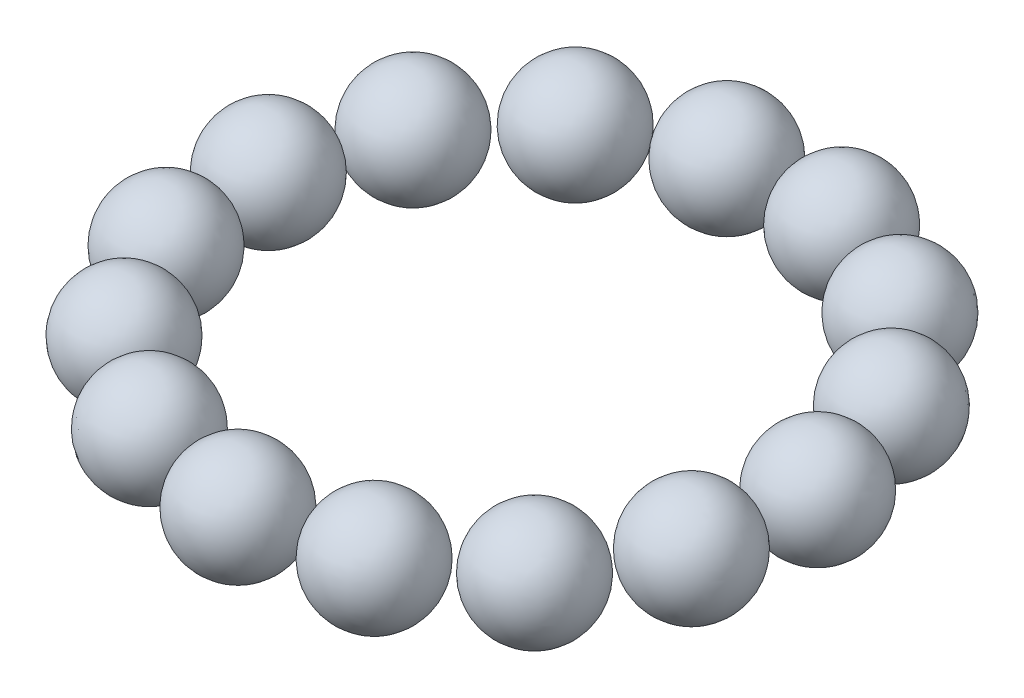
ISO-10303-21;
HEADER;
FILE_DESCRIPTION(('STEP AP214'),'2;1');
FILE_NAME('part.step','',(''),(''),'','','');
FILE_SCHEMA(('AUTOMOTIVE_DESIGN { 1 0 10303 214 1 1 1 1 }'));
ENDSEC;
DATA;
#1=APPLICATION_CONTEXT('core data for automotive mechanical design processes');
#2=APPLICATION_PROTOCOL_DEFINITION('international standard','automotive_design',2000,#1);
#3=PRODUCT_CONTEXT('',#1,'mechanical');
#4=PRODUCT('Part','Part','',(#3));
#5=PRODUCT_RELATED_PRODUCT_CATEGORY('part','',(#4));
#6=PRODUCT_DEFINITION_FORMATION('','',#4);
#7=PRODUCT_DEFINITION_CONTEXT('part definition',#1,'design');
#8=PRODUCT_DEFINITION('design','',#6,#7);
#9=PRODUCT_DEFINITION_SHAPE('','',#8);
#10=(LENGTH_UNIT() NAMED_UNIT(*) SI_UNIT(.MILLI.,.METRE.));
#11=(NAMED_UNIT(*) PLANE_ANGLE_UNIT() SI_UNIT($,.RADIAN.));
#12=(NAMED_UNIT(*) SI_UNIT($,.STERADIAN.) SOLID_ANGLE_UNIT());
#13=UNCERTAINTY_MEASURE_WITH_UNIT(LENGTH_MEASURE(1.E-05),#10,'distance_accuracy_value','');
#14=(GEOMETRIC_REPRESENTATION_CONTEXT(3) GLOBAL_UNCERTAINTY_ASSIGNED_CONTEXT((#13)) GLOBAL_UNIT_ASSIGNED_CONTEXT((#10,
#11,#12)) REPRESENTATION_CONTEXT('',''));
#15=CARTESIAN_POINT('',(0.,0.,0.));
#16=DIRECTION('',(0.,0.,1.));
#17=DIRECTION('',(1.,0.,0.));
#18=AXIS2_PLACEMENT_3D('',#15,#16,#17);
#19=CARTESIAN_POINT('',(-8.13473286151578,0.,18.2709091528521));
#20=DIRECTION('',(0.,-1.,0.));
#21=DIRECTION('',(-0.406736643075789,0.,0.913545457642606));
#22=AXIS2_PLACEMENT_3D('',#19,#20,#21);
#23=SPHERICAL_SURFACE('',#22,4.);
#24=CARTESIAN_POINT('',(-8.13473286151578,-4.,18.2709091528521));
#25=VERTEX_POINT('',#24);
#26=VERTEX_LOOP('',#25);
#27=FACE_BOUND('',#26,.T.);
#28=ADVANCED_FACE('F46',(#27),#23,.T.);
#29=CLOSED_SHELL('',(#28));
#30=MANIFOLD_SOLID_BREP('B2',#29);
#31=CARTESIAN_POINT('',(-14.8628965095477,0.,13.3826121271773));
#32=DIRECTION('',(0.,-1.,0.));
#33=DIRECTION('',(-0.743144825477386,0.,0.669130606358867));
#34=AXIS2_PLACEMENT_3D('',#31,#32,#33);
#35=SPHERICAL_SURFACE('',#34,4.);
#36=CARTESIAN_POINT('',(-14.8628965095477,-4.,13.3826121271773));
#37=VERTEX_POINT('',#36);
#38=VERTEX_LOOP('',#37);
#39=FACE_BOUND('',#38,.T.);
#40=ADVANCED_FACE('F61',(#39),#35,.T.);
#41=CLOSED_SHELL('',(#40));
#42=MANIFOLD_SOLID_BREP('B6',#41);
#43=CARTESIAN_POINT('',(-19.021130325903,0.,6.18033988749915));
#44=DIRECTION('',(0.,-1.,0.));
#45=DIRECTION('',(-0.95105651629515,0.,0.309016994374957));
#46=AXIS2_PLACEMENT_3D('',#43,#44,#45);
#47=SPHERICAL_SURFACE('',#46,4.);
#48=CARTESIAN_POINT('',(-19.021130325903,-4.,6.18033988749915));
#49=VERTEX_POINT('',#48);
#50=VERTEX_LOOP('',#49);
#51=FACE_BOUND('',#50,.T.);
#52=ADVANCED_FACE('F81',(#51),#47,.T.);
#53=CLOSED_SHELL('',(#52));
#54=MANIFOLD_SOLID_BREP('B45',#53);
#55=CARTESIAN_POINT('',(-19.8904379073655,0.,-2.09056926535287));
#56=DIRECTION('',(0.,-1.,0.));
#57=DIRECTION('',(-0.994521895368274,0.,-0.104528463267644));
#58=AXIS2_PLACEMENT_3D('',#55,#56,#57);
#59=SPHERICAL_SURFACE('',#58,4.);
#60=CARTESIAN_POINT('',(-19.8904379073655,-4.,-2.09056926535287));
#61=VERTEX_POINT('',#60);
#62=VERTEX_LOOP('',#61);
#63=FACE_BOUND('',#62,.T.);
#64=ADVANCED_FACE('F103',(#63),#59,.T.);
#65=CLOSED_SHELL('',(#64));
#66=MANIFOLD_SOLID_BREP('B63',#65);
#67=CARTESIAN_POINT('',(-17.3205080756889,0.,-9.99999999999984));
#68=DIRECTION('',(0.,-1.,0.));
#69=DIRECTION('',(-0.866025403784443,0.,-0.499999999999992));
#70=AXIS2_PLACEMENT_3D('',#67,#68,#69);
#71=SPHERICAL_SURFACE('',#70,4.);
#72=CARTESIAN_POINT('',(-17.3205080756889,-4.,-9.99999999999984));
#73=VERTEX_POINT('',#72);
#74=VERTEX_LOOP('',#73);
#75=FACE_BOUND('',#74,.T.);
#76=ADVANCED_FACE('F124',(#75),#71,.T.);
#77=CLOSED_SHELL('',(#76));
#78=MANIFOLD_SOLID_BREP('B76',#77);
#79=CARTESIAN_POINT('',(-11.7557050458496,0.,-16.1803398874988));
#80=DIRECTION('',(0.,-1.,0.));
#81=DIRECTION('',(-0.58778525229248,0.,-0.809016994374943));
#82=AXIS2_PLACEMENT_3D('',#79,#80,#81);
#83=SPHERICAL_SURFACE('',#82,4.);
#84=CARTESIAN_POINT('',(-11.7557050458496,-4.,-16.1803398874988));
#85=VERTEX_POINT('',#84);
#86=VERTEX_LOOP('',#85);
#87=FACE_BOUND('',#86,.T.);
#88=ADVANCED_FACE('F143',(#87),#83,.T.);
#89=CLOSED_SHELL('',(#88));
#90=MANIFOLD_SOLID_BREP('B97',#89);
#91=CARTESIAN_POINT('',(-4.15823381635533,0.,-19.5629520146761));
#92=DIRECTION('',(0.,-1.,0.));
#93=DIRECTION('',(-0.207911690817766,0.,-0.978147600733804));
#94=AXIS2_PLACEMENT_3D('',#91,#92,#93);
#95=SPHERICAL_SURFACE('',#94,4.);
#96=CARTESIAN_POINT('',(-4.15823381635533,-4.,-19.5629520146761));
#97=VERTEX_POINT('',#96);
#98=VERTEX_LOOP('',#97);
#99=FACE_BOUND('',#98,.T.);
#100=ADVANCED_FACE('F159',(#99),#95,.T.);
#101=CLOSED_SHELL('',(#100));
#102=MANIFOLD_SOLID_BREP('B117',#101);
#103=CARTESIAN_POINT('',(4.15823381635507,0.,-19.5629520146761));
#104=DIRECTION('',(0.,-1.,0.));
#105=DIRECTION('',(0.207911690817753,0.,-0.978147600733807));
#106=AXIS2_PLACEMENT_3D('',#103,#104,#105);
#107=SPHERICAL_SURFACE('',#106,4.);
#108=CARTESIAN_POINT('',(4.15823381635507,-4.,-19.5629520146761));
#109=VERTEX_POINT('',#108);
#110=VERTEX_LOOP('',#109);
#111=FACE_BOUND('',#110,.T.);
#112=ADVANCED_FACE('F176',(#111),#107,.T.);
#113=CLOSED_SHELL('',(#112));
#114=MANIFOLD_SOLID_BREP('B139',#113);
#115=CARTESIAN_POINT('',(11.7557050458494,0.,-16.180339887499));
#116=DIRECTION('',(0.,-1.,0.));
#117=DIRECTION('',(0.587785252292469,0.,-0.80901699437495));
#118=AXIS2_PLACEMENT_3D('',#115,#116,#117);
#119=SPHERICAL_SURFACE('',#118,4.);
#120=CARTESIAN_POINT('',(11.7557050458494,-4.,-16.180339887499));
#121=VERTEX_POINT('',#120);
#122=VERTEX_LOOP('',#121);
#123=FACE_BOUND('',#122,.T.);
#124=ADVANCED_FACE('F196',(#123),#119,.T.);
#125=CLOSED_SHELL('',(#124));
#126=MANIFOLD_SOLID_BREP('B156',#125);
#127=CARTESIAN_POINT('',(17.3205080756887,0.,-10.0000000000001));
#128=DIRECTION('',(0.,-1.,0.));
#129=DIRECTION('',(0.866025403784436,0.,-0.500000000000004));
#130=AXIS2_PLACEMENT_3D('',#127,#128,#129);
#131=SPHERICAL_SURFACE('',#130,4.);
#132=CARTESIAN_POINT('',(17.3205080756887,-4.,-10.0000000000001));
#133=VERTEX_POINT('',#132);
#134=VERTEX_LOOP('',#133);
#135=FACE_BOUND('',#134,.T.);
#136=ADVANCED_FACE('F220',(#135),#131,.T.);
#137=CLOSED_SHELL('',(#136));
#138=MANIFOLD_SOLID_BREP('B171',#137);
#139=CARTESIAN_POINT('',(19.8904379073655,0.,-2.09056926535314));
#140=DIRECTION('',(0.,-1.,0.));
#141=DIRECTION('',(0.994521895368273,0.,-0.104528463267657));
#142=AXIS2_PLACEMENT_3D('',#139,#140,#141);
#143=SPHERICAL_SURFACE('',#142,4.);
#144=CARTESIAN_POINT('',(19.8904379073655,-4.,-2.09056926535314));
#145=VERTEX_POINT('',#144);
#146=VERTEX_LOOP('',#145);
#147=FACE_BOUND('',#146,.T.);
#148=ADVANCED_FACE('F237',(#147),#143,.T.);
#149=CLOSED_SHELL('',(#148));
#150=MANIFOLD_SOLID_BREP('B191',#149);
#151=CARTESIAN_POINT('',(19.0211303259031,0.,6.1803398874989));
#152=DIRECTION('',(0.,-1.,0.));
#153=DIRECTION('',(0.951056516295154,0.,0.309016994374945));
#154=AXIS2_PLACEMENT_3D('',#151,#152,#153);
#155=SPHERICAL_SURFACE('',#154,4.);
#156=CARTESIAN_POINT('',(19.0211303259031,-4.,6.1803398874989));
#157=VERTEX_POINT('',#156);
#158=VERTEX_LOOP('',#157);
#159=FACE_BOUND('',#158,.T.);
#160=ADVANCED_FACE('F254',(#159),#155,.T.);
#161=CLOSED_SHELL('',(#160));
#162=MANIFOLD_SOLID_BREP('B213',#161);
#163=CARTESIAN_POINT('',(14.8628965095479,0.,13.3826121271771));
#164=DIRECTION('',(0.,-1.,0.));
#165=DIRECTION('',(0.743144825477395,0.,0.669130606358857));
#166=AXIS2_PLACEMENT_3D('',#163,#164,#165);
#167=SPHERICAL_SURFACE('',#166,4.);
#168=CARTESIAN_POINT('',(14.8628965095479,-4.,13.3826121271771));
#169=VERTEX_POINT('',#168);
#170=VERTEX_LOOP('',#169);
#171=FACE_BOUND('',#170,.T.);
#172=ADVANCED_FACE('F273',(#171),#167,.T.);
#173=CLOSED_SHELL('',(#172));
#174=MANIFOLD_SOLID_BREP('B234',#173);
#175=CARTESIAN_POINT('',(8.13473286151602,0.,18.270909152852));
#176=DIRECTION('',(0.,-1.,0.));
#177=DIRECTION('',(0.406736643075801,0.,0.913545457642601));
#178=AXIS2_PLACEMENT_3D('',#175,#176,#177);
#179=SPHERICAL_SURFACE('',#178,4.);
#180=CARTESIAN_POINT('',(8.13473286151602,-4.,18.270909152852));
#181=VERTEX_POINT('',#180);
#182=VERTEX_LOOP('',#181);
#183=FACE_BOUND('',#182,.T.);
#184=ADVANCED_FACE('F295',(#183),#179,.T.);
#185=CLOSED_SHELL('',(#184));
#186=MANIFOLD_SOLID_BREP('B253',#185);
#187=CARTESIAN_POINT('',(0.,0.,20.));
#188=DIRECTION('',(0.,-1.,0.));
#189=DIRECTION('',(0.,0.,1.));
#190=AXIS2_PLACEMENT_3D('',#187,#188,#189);
#191=SPHERICAL_SURFACE('',#190,4.);
#192=CARTESIAN_POINT('',(0.,-4.,20.));
#193=VERTEX_POINT('',#192);
#194=VERTEX_LOOP('',#193);
#195=FACE_BOUND('',#194,.T.);
#196=ADVANCED_FACE('F303',(#195),#191,.T.);
#197=CLOSED_SHELL('',(#196));
#198=MANIFOLD_SOLID_BREP('B269',#197);
#199=ADVANCED_BREP_SHAPE_REPRESENTATION('',(#18,#30,#42,#54,#66,#78,#90,#102,#114,#126,#138,
#150,#162,#174,#186,#198),#14);
#200=SHAPE_DEFINITION_REPRESENTATION(#9,#199);
ENDSEC;
END-ISO-10303-21;
